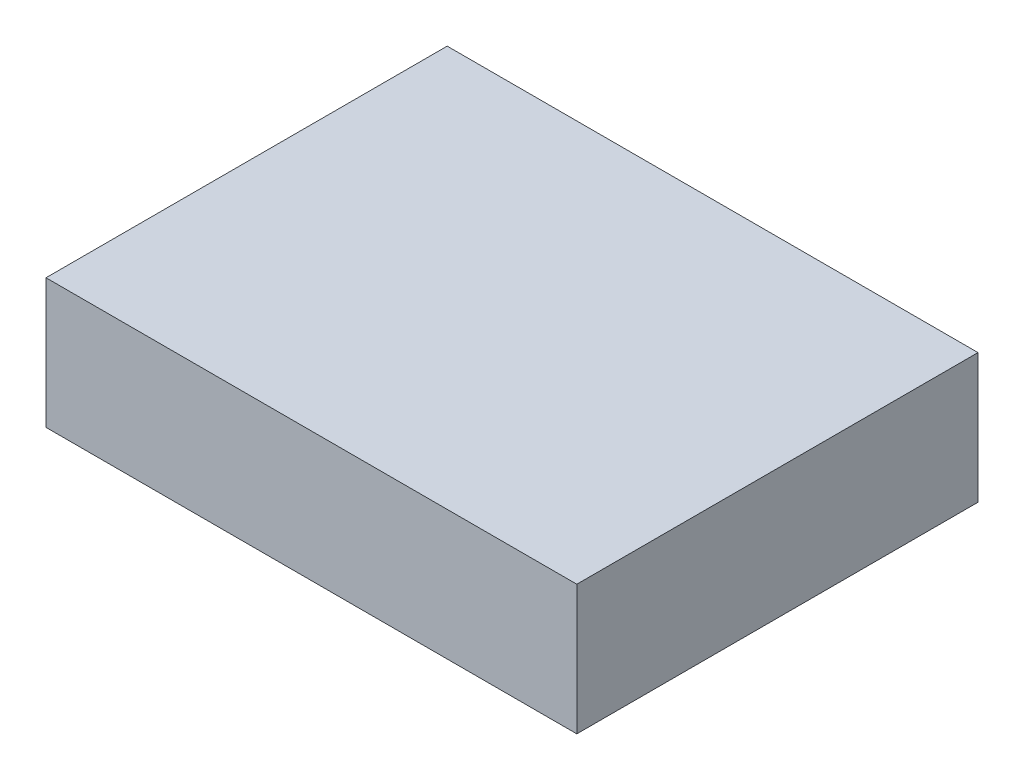
ISO-10303-21;
HEADER;
FILE_DESCRIPTION(('STEP AP214'),'2;1');
FILE_NAME('part.step','',(''),(''),'','','');
FILE_SCHEMA(('AUTOMOTIVE_DESIGN { 1 0 10303 214 1 1 1 1 }'));
ENDSEC;
DATA;
#1=APPLICATION_CONTEXT('core data for automotive mechanical design processes');
#2=APPLICATION_PROTOCOL_DEFINITION('international standard','automotive_design',2000,#1);
#3=PRODUCT_CONTEXT('',#1,'mechanical');
#4=PRODUCT('Part','Part','',(#3));
#5=PRODUCT_RELATED_PRODUCT_CATEGORY('part','',(#4));
#6=PRODUCT_DEFINITION_FORMATION('','',#4);
#7=PRODUCT_DEFINITION_CONTEXT('part definition',#1,'design');
#8=PRODUCT_DEFINITION('design','',#6,#7);
#9=PRODUCT_DEFINITION_SHAPE('','',#8);
#10=(LENGTH_UNIT() NAMED_UNIT(*) SI_UNIT(.MILLI.,.METRE.));
#11=(NAMED_UNIT(*) PLANE_ANGLE_UNIT() SI_UNIT($,.RADIAN.));
#12=(NAMED_UNIT(*) SI_UNIT($,.STERADIAN.) SOLID_ANGLE_UNIT());
#13=UNCERTAINTY_MEASURE_WITH_UNIT(LENGTH_MEASURE(1.E-05),#10,'distance_accuracy_value','');
#14=(GEOMETRIC_REPRESENTATION_CONTEXT(3) GLOBAL_UNCERTAINTY_ASSIGNED_CONTEXT((#13)) GLOBAL_UNIT_ASSIGNED_CONTEXT((#10,
#11,#12)) REPRESENTATION_CONTEXT('',''));
#15=CARTESIAN_POINT('',(0.,0.,0.));
#16=DIRECTION('',(0.,0.,1.));
#17=DIRECTION('',(1.,0.,0.));
#18=AXIS2_PLACEMENT_3D('',#15,#16,#17);
#19=CARTESIAN_POINT('',(43.,21.,-32.5));
#20=DIRECTION('',(-1.,0.,0.));
#21=DIRECTION('',(0.,0.,1.));
#22=AXIS2_PLACEMENT_3D('',#19,#20,#21);
#23=PLANE('',#22);
#24=DIRECTION('',(0.,0.,-1.));
#25=VECTOR('',#24,1.);
#26=CARTESIAN_POINT('',(43.,0.,-32.5));
#27=LINE('',#26,#25);
#28=CARTESIAN_POINT('',(43.,0.,32.5));
#29=VERTEX_POINT('',#28);
#30=CARTESIAN_POINT('',(43.,0.,-32.5));
#31=VERTEX_POINT('',#30);
#32=EDGE_CURVE('E96',#29,#31,#27,.T.);
#33=ORIENTED_EDGE('',*,*,#32,.T.);
#34=DIRECTION('',(0.,-1.,0.));
#35=VECTOR('',#34,1.);
#36=CARTESIAN_POINT('',(43.,21.,-32.5));
#37=LINE('',#36,#35);
#38=CARTESIAN_POINT('',(43.,21.,-32.5));
#39=VERTEX_POINT('',#38);
#40=EDGE_CURVE('E11',#39,#31,#37,.T.);
#41=ORIENTED_EDGE('',*,*,#40,.F.);
#42=DIRECTION('',(0.,0.,-1.));
#43=VECTOR('',#42,1.);
#44=CARTESIAN_POINT('',(43.,21.,-32.5));
#45=LINE('',#44,#43);
#46=CARTESIAN_POINT('',(43.,21.,32.5));
#47=VERTEX_POINT('',#46);
#48=EDGE_CURVE('E84',#47,#39,#45,.T.);
#49=ORIENTED_EDGE('',*,*,#48,.F.);
#50=DIRECTION('',(0.,-1.,0.));
#51=VECTOR('',#50,1.);
#52=CARTESIAN_POINT('',(43.,21.,32.5));
#53=LINE('',#52,#51);
#54=EDGE_CURVE('E92',#47,#29,#53,.T.);
#55=ORIENTED_EDGE('',*,*,#54,.T.);
#56=EDGE_LOOP('',(#33,#41,#49,#55));
#57=FACE_BOUND('',#56,.T.);
#58=ADVANCED_FACE('F33',(#57),#23,.F.);
#59=CARTESIAN_POINT('',(-43.,21.,-32.5));
#60=DIRECTION('',(0.,0.,1.));
#61=DIRECTION('',(1.,0.,0.));
#62=AXIS2_PLACEMENT_3D('',#59,#60,#61);
#63=PLANE('',#62);
#64=DIRECTION('',(-1.,0.,0.));
#65=VECTOR('',#64,1.);
#66=CARTESIAN_POINT('',(-43.,0.,-32.5));
#67=LINE('',#66,#65);
#68=CARTESIAN_POINT('',(-43.,0.,-32.5));
#69=VERTEX_POINT('',#68);
#70=EDGE_CURVE('E88',#31,#69,#67,.T.);
#71=ORIENTED_EDGE('',*,*,#70,.T.);
#72=DIRECTION('',(0.,-1.,0.));
#73=VECTOR('',#72,1.);
#74=CARTESIAN_POINT('',(-43.,21.,-32.5));
#75=LINE('',#74,#73);
#76=CARTESIAN_POINT('',(-43.,21.,-32.5));
#77=VERTEX_POINT('',#76);
#78=EDGE_CURVE('E41',#77,#69,#75,.T.);
#79=ORIENTED_EDGE('',*,*,#78,.F.);
#80=DIRECTION('',(-1.,0.,0.));
#81=VECTOR('',#80,1.);
#82=CARTESIAN_POINT('',(-43.,21.,-32.5));
#83=LINE('',#82,#81);
#84=EDGE_CURVE('E79',#39,#77,#83,.T.);
#85=ORIENTED_EDGE('',*,*,#84,.F.);
#86=ORIENTED_EDGE('',*,*,#40,.T.);
#87=EDGE_LOOP('',(#71,#79,#85,#86));
#88=FACE_BOUND('',#87,.T.);
#89=ADVANCED_FACE('F87',(#88),#63,.F.);
#90=CARTESIAN_POINT('',(-43.,21.,-32.5));
#91=DIRECTION('',(1.,0.,0.));
#92=DIRECTION('',(0.,0.,-1.));
#93=AXIS2_PLACEMENT_3D('',#90,#91,#92);
#94=PLANE('',#93);
#95=DIRECTION('',(0.,0.,1.));
#96=VECTOR('',#95,1.);
#97=CARTESIAN_POINT('',(-43.,0.,-32.5));
#98=LINE('',#97,#96);
#99=CARTESIAN_POINT('',(-43.,0.,32.5));
#100=VERTEX_POINT('',#99);
#101=EDGE_CURVE('E66',#69,#100,#98,.T.);
#102=ORIENTED_EDGE('',*,*,#101,.T.);
#103=DIRECTION('',(0.,-1.,0.));
#104=VECTOR('',#103,1.);
#105=CARTESIAN_POINT('',(-43.,21.,32.5));
#106=LINE('',#105,#104);
#107=CARTESIAN_POINT('',(-43.,21.,32.5));
#108=VERTEX_POINT('',#107);
#109=EDGE_CURVE('E89',#108,#100,#106,.T.);
#110=ORIENTED_EDGE('',*,*,#109,.F.);
#111=DIRECTION('',(0.,0.,1.));
#112=VECTOR('',#111,1.);
#113=CARTESIAN_POINT('',(-43.,21.,-32.5));
#114=LINE('',#113,#112);
#115=EDGE_CURVE('E82',#77,#108,#114,.T.);
#116=ORIENTED_EDGE('',*,*,#115,.F.);
#117=ORIENTED_EDGE('',*,*,#78,.T.);
#118=EDGE_LOOP('',(#102,#110,#116,#117));
#119=FACE_BOUND('',#118,.T.);
#120=ADVANCED_FACE('F90',(#119),#94,.F.);
#121=CARTESIAN_POINT('',(-43.,21.,32.5));
#122=DIRECTION('',(0.,0.,-1.));
#123=DIRECTION('',(-1.,0.,0.));
#124=AXIS2_PLACEMENT_3D('',#121,#122,#123);
#125=PLANE('',#124);
#126=DIRECTION('',(1.,0.,0.));
#127=VECTOR('',#126,1.);
#128=CARTESIAN_POINT('',(-43.,0.,32.5));
#129=LINE('',#128,#127);
#130=EDGE_CURVE('E72',#100,#29,#129,.T.);
#131=ORIENTED_EDGE('',*,*,#130,.T.);
#132=ORIENTED_EDGE('',*,*,#54,.F.);
#133=DIRECTION('',(1.,0.,0.));
#134=VECTOR('',#133,1.);
#135=CARTESIAN_POINT('',(-43.,21.,32.5));
#136=LINE('',#135,#134);
#137=EDGE_CURVE('E49',#108,#47,#136,.T.);
#138=ORIENTED_EDGE('',*,*,#137,.F.);
#139=ORIENTED_EDGE('',*,*,#109,.T.);
#140=EDGE_LOOP('',(#131,#132,#138,#139));
#141=FACE_BOUND('',#140,.T.);
#142=ADVANCED_FACE('F103',(#141),#125,.F.);
#143=CARTESIAN_POINT('',(0.,21.,0.));
#144=DIRECTION('',(0.,1.,0.));
#145=DIRECTION('',(0.,0.,1.));
#146=AXIS2_PLACEMENT_3D('',#143,#144,#145);
#147=PLANE('',#146);
#148=ORIENTED_EDGE('',*,*,#48,.T.);
#149=ORIENTED_EDGE('',*,*,#84,.T.);
#150=ORIENTED_EDGE('',*,*,#115,.T.);
#151=ORIENTED_EDGE('',*,*,#137,.T.);
#152=EDGE_LOOP('',(#148,#149,#150,#151));
#153=FACE_BOUND('',#152,.T.);
#154=ADVANCED_FACE('F80',(#153),#147,.T.);
#155=CARTESIAN_POINT('',(0.,0.,0.));
#156=DIRECTION('',(0.,1.,0.));
#157=DIRECTION('',(0.,0.,1.));
#158=AXIS2_PLACEMENT_3D('',#155,#156,#157);
#159=PLANE('',#158);
#160=ORIENTED_EDGE('',*,*,#32,.F.);
#161=ORIENTED_EDGE('',*,*,#130,.F.);
#162=ORIENTED_EDGE('',*,*,#101,.F.);
#163=ORIENTED_EDGE('',*,*,#70,.F.);
#164=EDGE_LOOP('',(#160,#161,#162,#163));
#165=FACE_BOUND('',#164,.T.);
#166=ADVANCED_FACE('F106',(#165),#159,.F.);
#167=CLOSED_SHELL('',(#58,#89,#120,#142,#154,#166));
#168=MANIFOLD_SOLID_BREP('B2',#167);
#169=ADVANCED_BREP_SHAPE_REPRESENTATION('',(#18,#168),#14);
#170=SHAPE_DEFINITION_REPRESENTATION(#9,#169);
ENDSEC;
END-ISO-10303-21;
